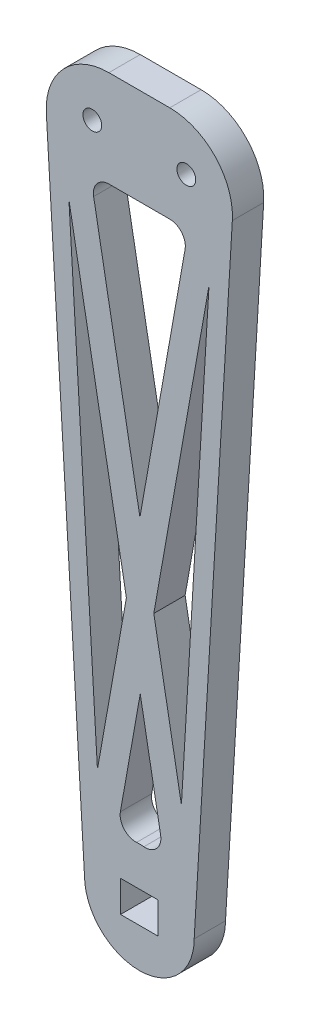
ISO-10303-21;
HEADER;
FILE_DESCRIPTION(('STEP AP214'),'2;1');
FILE_NAME('part.step','',(''),(''),'','','');
FILE_SCHEMA(('AUTOMOTIVE_DESIGN { 1 0 10303 214 1 1 1 1 }'));
ENDSEC;
DATA;
#1=APPLICATION_CONTEXT('core data for automotive mechanical design processes');
#2=APPLICATION_PROTOCOL_DEFINITION('international standard','automotive_design',2000,#1);
#3=PRODUCT_CONTEXT('',#1,'mechanical');
#4=PRODUCT('Part','Part','',(#3));
#5=PRODUCT_RELATED_PRODUCT_CATEGORY('part','',(#4));
#6=PRODUCT_DEFINITION_FORMATION('','',#4);
#7=PRODUCT_DEFINITION_CONTEXT('part definition',#1,'design');
#8=PRODUCT_DEFINITION('design','',#6,#7);
#9=PRODUCT_DEFINITION_SHAPE('','',#8);
#10=(LENGTH_UNIT() NAMED_UNIT(*) SI_UNIT(.MILLI.,.METRE.));
#11=(NAMED_UNIT(*) PLANE_ANGLE_UNIT() SI_UNIT($,.RADIAN.));
#12=(NAMED_UNIT(*) SI_UNIT($,.STERADIAN.) SOLID_ANGLE_UNIT());
#13=UNCERTAINTY_MEASURE_WITH_UNIT(LENGTH_MEASURE(1.E-05),#10,'distance_accuracy_value','');
#14=(GEOMETRIC_REPRESENTATION_CONTEXT(3) GLOBAL_UNCERTAINTY_ASSIGNED_CONTEXT((#13)) GLOBAL_UNIT_ASSIGNED_CONTEXT((#10,
#11,#12)) REPRESENTATION_CONTEXT('',''));
#15=CARTESIAN_POINT('',(0.,0.,0.));
#16=DIRECTION('',(0.,0.,1.));
#17=DIRECTION('',(1.,0.,0.));
#18=AXIS2_PLACEMENT_3D('',#15,#16,#17);
#19=CARTESIAN_POINT('',(0.,0.,10.));
#20=DIRECTION('',(0.,0.,1.));
#21=DIRECTION('',(1.,0.,0.));
#22=AXIS2_PLACEMENT_3D('',#19,#20,#21);
#23=PLANE('',#22);
#24=DIRECTION('',(-0.0594186399842153,-0.998233151734817,0.));
#25=VECTOR('',#24,1.);
#26=CARTESIAN_POINT('',(29.8940827566728,-1.77940968789719,10.));
#27=LINE('',#26,#25);
#28=CARTESIAN_POINT('',(29.6775023841983,-5.41795994546837,10.));
#29=VERTEX_POINT('',#28);
#30=CARTESIAN_POINT('',(17.5,-210.,10.));
#31=VERTEX_POINT('',#30);
#32=EDGE_CURVE('E382',#29,#31,#27,.T.);
#33=ORIENTED_EDGE('',*,*,#32,.F.);
#34=CARTESIAN_POINT('',(9.71283934950197,-4.22958714578407,10.));
#35=DIRECTION('',(0.,0.,1.));
#36=DIRECTION('',(1.,0.,0.));
#37=AXIS2_PLACEMENT_3D('',#34,#35,#36);
#38=CIRCLE('',#37,20.);
#39=CARTESIAN_POINT('',(9.71283934950197,15.7704128542159,10.));
#40=VERTEX_POINT('',#39);
#41=EDGE_CURVE('E461',#29,#40,#38,.T.);
#42=ORIENTED_EDGE('',*,*,#41,.T.);
#43=DIRECTION('',(1.,0.,0.));
#44=VECTOR('',#43,1.);
#45=CARTESIAN_POINT('',(0.,15.7704128542159,10.));
#46=LINE('',#45,#44);
#47=CARTESIAN_POINT('',(-9.71283934950197,15.7704128542159,10.));
#48=VERTEX_POINT('',#47);
#49=EDGE_CURVE('E384',#48,#40,#46,.T.);
#50=ORIENTED_EDGE('',*,*,#49,.F.);
#51=CARTESIAN_POINT('',(-9.71283934950197,-4.22958714578407,10.));
#52=DIRECTION('',(0.,0.,1.));
#53=DIRECTION('',(1.,0.,0.));
#54=AXIS2_PLACEMENT_3D('',#51,#52,#53);
#55=CIRCLE('',#54,20.);
#56=CARTESIAN_POINT('',(-29.6775023841983,-5.41795994546837,10.));
#57=VERTEX_POINT('',#56);
#58=EDGE_CURVE('E452',#48,#57,#55,.T.);
#59=ORIENTED_EDGE('',*,*,#58,.T.);
#60=DIRECTION('',(0.0594186399842153,-0.998233151734817,0.));
#61=VECTOR('',#60,1.);
#62=CARTESIAN_POINT('',(-29.8940827566728,-1.77940968789719,10.));
#63=LINE('',#62,#61);
#64=CARTESIAN_POINT('',(-17.5,-210.,10.));
#65=VERTEX_POINT('',#64);
#66=EDGE_CURVE('E376',#57,#65,#63,.T.);
#67=ORIENTED_EDGE('',*,*,#66,.T.);
#68=CARTESIAN_POINT('',(0.,-210.,10.));
#69=DIRECTION('',(0.,0.,1.));
#70=DIRECTION('',(1.,0.,0.));
#71=AXIS2_PLACEMENT_3D('',#68,#69,#70);
#72=CIRCLE('',#71,17.5);
#73=EDGE_CURVE('E378',#65,#31,#72,.T.);
#74=ORIENTED_EDGE('',*,*,#73,.T.);
#75=EDGE_LOOP('',(#33,#42,#50,#59,#67,#74));
#76=FACE_BOUND('',#75,.T.);
#77=CARTESIAN_POINT('',(15.,0.,10.));
#78=DIRECTION('',(0.,0.,1.));
#79=DIRECTION('',(1.,0.,0.));
#80=AXIS2_PLACEMENT_3D('',#77,#78,#79);
#81=CIRCLE('',#80,3.);
#82=CARTESIAN_POINT('',(18.,0.,10.));
#83=VERTEX_POINT('',#82);
#84=EDGE_CURVE('E387',#83,#83,#81,.T.);
#85=ORIENTED_EDGE('',*,*,#84,.F.);
#86=EDGE_LOOP('',(#85));
#87=FACE_BOUND('',#86,.T.);
#88=CARTESIAN_POINT('',(-15.,0.,10.));
#89=DIRECTION('',(0.,0.,1.));
#90=DIRECTION('',(1.,0.,0.));
#91=AXIS2_PLACEMENT_3D('',#88,#89,#90);
#92=CIRCLE('',#91,3.);
#93=CARTESIAN_POINT('',(-12.,0.,10.));
#94=VERTEX_POINT('',#93);
#95=EDGE_CURVE('E390',#94,#94,#92,.T.);
#96=ORIENTED_EDGE('',*,*,#95,.F.);
#97=EDGE_LOOP('',(#96));
#98=FACE_BOUND('',#97,.T.);
#99=DIRECTION('',(0.,1.,0.));
#100=VECTOR('',#99,1.);
#101=CARTESIAN_POINT('',(-6.00000000000001,0.,10.));
#102=LINE('',#101,#100);
#103=CARTESIAN_POINT('',(-6.00000000000001,-215.,10.));
#104=VERTEX_POINT('',#103);
#105=CARTESIAN_POINT('',(-6.00000000000001,-205.,10.));
#106=VERTEX_POINT('',#105);
#107=EDGE_CURVE('E393',#104,#106,#102,.T.);
#108=ORIENTED_EDGE('',*,*,#107,.T.);
#109=DIRECTION('',(1.,0.,0.));
#110=VECTOR('',#109,1.);
#111=CARTESIAN_POINT('',(4.74157750100327E-13,-205.,10.));
#112=LINE('',#111,#110);
#113=CARTESIAN_POINT('',(6.,-205.,10.));
#114=VERTEX_POINT('',#113);
#115=EDGE_CURVE('E396',#106,#114,#112,.T.);
#116=ORIENTED_EDGE('',*,*,#115,.T.);
#117=DIRECTION('',(0.,1.,0.));
#118=VECTOR('',#117,1.);
#119=CARTESIAN_POINT('',(5.99999999999989,0.,10.));
#120=LINE('',#119,#118);
#121=CARTESIAN_POINT('',(6.00000000000001,-215.,10.));
#122=VERTEX_POINT('',#121);
#123=EDGE_CURVE('E398',#122,#114,#120,.T.);
#124=ORIENTED_EDGE('',*,*,#123,.F.);
#125=DIRECTION('',(1.,0.,0.));
#126=VECTOR('',#125,1.);
#127=CARTESIAN_POINT('',(-4.97287396446684E-13,-215.,10.));
#128=LINE('',#127,#126);
#129=EDGE_CURVE('E401',#104,#122,#128,.T.);
#130=ORIENTED_EDGE('',*,*,#129,.F.);
#131=EDGE_LOOP('',(#108,#116,#124,#130));
#132=FACE_BOUND('',#131,.T.);
#133=DIRECTION('',(0.174574666070561,0.984643938673444,0.));
#134=VECTOR('',#133,1.);
#135=CARTESIAN_POINT('',(17.7452712206691,-3.14618785126878,10.));
#136=LINE('',#135,#134);
#137=CARTESIAN_POINT('',(0.190220551076297,-102.160979768059,10.));
#138=VERTEX_POINT('',#137);
#139=CARTESIAN_POINT('',(14.6023785703389,-20.8728733303528,10.));
#140=VERTEX_POINT('',#139);
#141=EDGE_CURVE('E370',#138,#140,#136,.T.);
#142=ORIENTED_EDGE('',*,*,#141,.F.);
#143=DIRECTION('',(-0.178826073356073,0.983880701857724,0.));
#144=VECTOR('',#143,1.);
#145=CARTESIAN_POINT('',(-17.7904251161172,-3.23351384049256,10.));
#146=LINE('',#145,#144);
#147=CARTESIAN_POINT('',(-14.5805047462184,-20.8941303667804,10.));
#148=VERTEX_POINT('',#147);
#149=EDGE_CURVE('E334',#138,#148,#146,.T.);
#150=ORIENTED_EDGE('',*,*,#149,.T.);
#151=CARTESIAN_POINT('',(-9.66110123692979,-20.,10.));
#152=DIRECTION('',(0.,0.,1.));
#153=DIRECTION('',(1.,0.,0.));
#154=AXIS2_PLACEMENT_3D('',#151,#152,#153);
#155=CIRCLE('',#154,5.);
#156=CARTESIAN_POINT('',(-9.66110123692979,-15.,10.));
#157=VERTEX_POINT('',#156);
#158=EDGE_CURVE('E487',#148,#157,#155,.F.);
#159=ORIENTED_EDGE('',*,*,#158,.T.);
#160=DIRECTION('',(1.,0.,0.));
#161=VECTOR('',#160,1.);
#162=CARTESIAN_POINT('',(0.,-15.,10.));
#163=LINE('',#162,#161);
#164=CARTESIAN_POINT('',(9.67915887697167,-15.,10.));
#165=VERTEX_POINT('',#164);
#166=EDGE_CURVE('E362',#157,#165,#163,.T.);
#167=ORIENTED_EDGE('',*,*,#166,.T.);
#168=CARTESIAN_POINT('',(9.67915887697167,-20.,10.));
#169=DIRECTION('',(0.,0.,1.));
#170=DIRECTION('',(1.,0.,0.));
#171=AXIS2_PLACEMENT_3D('',#168,#169,#170);
#172=CIRCLE('',#171,5.);
#173=EDGE_CURVE('E115',#165,#140,#172,.F.);
#174=ORIENTED_EDGE('',*,*,#173,.T.);
#175=EDGE_LOOP('',(#142,#150,#159,#167,#174));
#176=FACE_BOUND('',#175,.T.);
#177=DIRECTION('',(-0.178826073356073,0.983880701857724,0.));
#178=VECTOR('',#177,1.);
#179=CARTESIAN_POINT('',(-26.2678721622271,-4.77433943497515,10.));
#180=LINE('',#179,#178);
#181=CARTESIAN_POINT('',(6.79531038371948,-186.684206595022,10.));
#182=VERTEX_POINT('',#181);
#183=CARTESIAN_POINT('',(0.29160959832128,-150.901585116392,10.));
#184=VERTEX_POINT('',#183);
#185=EDGE_CURVE('E283',#182,#184,#180,.T.);
#186=ORIENTED_EDGE('',*,*,#185,.F.);
#187=CARTESIAN_POINT('',(1.87590687443086,-187.578336961803,10.));
#188=DIRECTION('',(0.,0.,1.));
#189=DIRECTION('',(1.,0.,0.));
#190=AXIS2_PLACEMENT_3D('',#187,#188,#189);
#191=CIRCLE('',#190,5.);
#192=CARTESIAN_POINT('',(1.45903868011289,-192.560928748069,10.));
#193=VERTEX_POINT('',#192);
#194=EDGE_CURVE('E480',#182,#193,#191,.F.);
#195=ORIENTED_EDGE('',*,*,#194,.T.);
#196=CARTESIAN_POINT('',(0.,-210.,10.));
#197=DIRECTION('',(0.,0.,1.));
#198=DIRECTION('',(1.,0.,0.));
#199=AXIS2_PLACEMENT_3D('',#196,#197,#198);
#200=CIRCLE('',#199,17.5);
#201=CARTESIAN_POINT('',(-0.874372767581587,-192.521857299378,10.));
#202=VERTEX_POINT('',#201);
#203=EDGE_CURVE('E299',#193,#202,#200,.T.);
#204=ORIENTED_EDGE('',*,*,#203,.T.);
#205=CARTESIAN_POINT('',(-1.12419355831918,-187.528102242057,10.));
#206=DIRECTION('',(0.,0.,1.));
#207=DIRECTION('',(1.,0.,0.));
#208=AXIS2_PLACEMENT_3D('',#205,#206,#207);
#209=CIRCLE('',#208,5.);
#210=CARTESIAN_POINT('',(-6.0474132516864,-186.655228911704,10.));
#211=VERTEX_POINT('',#210);
#212=EDGE_CURVE('E285',#202,#211,#209,.F.);
#213=ORIENTED_EDGE('',*,*,#212,.T.);
#214=DIRECTION('',(0.174574666070561,0.984643938673444,0.));
#215=VECTOR('',#214,1.);
#216=CARTESIAN_POINT('',(26.2217824014059,-4.64905000346376,10.));
#217=LINE('',#216,#215);
#218=EDGE_CURVE('E280',#211,#184,#217,.T.);
#219=ORIENTED_EDGE('',*,*,#218,.T.);
#220=EDGE_LOOP('',(#186,#195,#204,#213,#219));
#221=FACE_BOUND('',#220,.T.);
#222=DIRECTION('',(-0.178826073356073,0.983880701857724,0.));
#223=VECTOR('',#222,1.);
#224=CARTESIAN_POINT('',(-17.7904251161172,-3.23351384049256,10.));
#225=LINE('',#224,#223);
#226=CARTESIAN_POINT('',(13.4301626709257,-175.005634358752,10.));
#227=VERTEX_POINT('',#226);
#228=CARTESIAN_POINT('',(4.61598635326493,-126.511039476885,10.));
#229=VERTEX_POINT('',#228);
#230=EDGE_CURVE('E308',#227,#229,#225,.T.);
#231=ORIENTED_EDGE('',*,*,#230,.T.);
#232=DIRECTION('',(0.174574666070561,0.984643938673444,0.));
#233=VECTOR('',#232,1.);
#234=CARTESIAN_POINT('',(26.2217824014059,-4.64905000346376,10.));
#235=LINE('',#234,#233);
#236=CARTESIAN_POINT('',(22.2304198411749,-27.1613138985647,10.));
#237=VERTEX_POINT('',#236);
#238=EDGE_CURVE('E305',#229,#237,#235,.T.);
#239=ORIENTED_EDGE('',*,*,#238,.T.);
#240=DIRECTION('',(-0.0594186399842153,-0.998233151734817,0.));
#241=VECTOR('',#240,1.);
#242=CARTESIAN_POINT('',(23.7629705178262,-1.41446253082299,10.));
#243=LINE('',#242,#241);
#244=EDGE_CURVE('E342',#237,#227,#243,.T.);
#245=ORIENTED_EDGE('',*,*,#244,.T.);
#246=EDGE_LOOP('',(#231,#239,#245));
#247=FACE_BOUND('',#246,.T.);
#248=DIRECTION('',(0.174574666070561,0.984643938673444,0.));
#249=VECTOR('',#248,1.);
#250=CARTESIAN_POINT('',(17.7452712206691,-3.14618785126878,10.));
#251=LINE('',#250,#249);
#252=CARTESIAN_POINT('',(-13.367328464566,-178.628881795291,10.));
#253=VERTEX_POINT('',#252);
#254=CARTESIAN_POINT('',(-4.13415620386734,-126.551525407566,10.));
#255=VERTEX_POINT('',#254);
#256=EDGE_CURVE('E326',#253,#255,#251,.T.);
#257=ORIENTED_EDGE('',*,*,#256,.F.);
#258=DIRECTION('',(-0.0594186399842153,0.998233151734817,0.));
#259=VECTOR('',#258,1.);
#260=CARTESIAN_POINT('',(-23.9152662053382,-1.42352775031775,10.));
#261=LINE('',#260,#259);
#262=CARTESIAN_POINT('',(-22.4730270714025,-25.6531452004381,10.));
#263=VERTEX_POINT('',#262);
#264=EDGE_CURVE('E323',#253,#263,#261,.T.);
#265=ORIENTED_EDGE('',*,*,#264,.T.);
#266=DIRECTION('',(-0.178826073356073,0.983880701857724,0.));
#267=VECTOR('',#266,1.);
#268=CARTESIAN_POINT('',(-26.2678721622271,-4.77433943497515,10.));
#269=LINE('',#268,#267);
#270=EDGE_CURVE('E316',#255,#263,#269,.T.);
#271=ORIENTED_EDGE('',*,*,#270,.F.);
#272=EDGE_LOOP('',(#257,#265,#271));
#273=FACE_BOUND('',#272,.T.);
#274=ADVANCED_FACE('F107',(#76,#87,#98,#132,#176,#221,#247,#273),#23,.T.);
#275=CARTESIAN_POINT('',(0.,0.,0.));
#276=DIRECTION('',(0.,0.,1.));
#277=DIRECTION('',(1.,0.,0.));
#278=AXIS2_PLACEMENT_3D('',#275,#276,#277);
#279=PLANE('',#278);
#280=DIRECTION('',(0.174574666070561,0.984643938673444,0.));
#281=VECTOR('',#280,1.);
#282=CARTESIAN_POINT('',(26.2217824014059,-4.64905000346376,0.));
#283=LINE('',#282,#281);
#284=CARTESIAN_POINT('',(4.61598635326493,-126.511039476885,0.));
#285=VERTEX_POINT('',#284);
#286=CARTESIAN_POINT('',(22.2304198411749,-27.1613138985647,0.));
#287=VERTEX_POINT('',#286);
#288=EDGE_CURVE('E339',#285,#287,#283,.T.);
#289=ORIENTED_EDGE('',*,*,#288,.F.);
#290=DIRECTION('',(-0.178826073356073,0.983880701857724,0.));
#291=VECTOR('',#290,1.);
#292=CARTESIAN_POINT('',(-17.7904251161172,-3.23351384049256,0.));
#293=LINE('',#292,#291);
#294=CARTESIAN_POINT('',(13.4301626709257,-175.005634358752,0.));
#295=VERTEX_POINT('',#294);
#296=EDGE_CURVE('E341',#295,#285,#293,.T.);
#297=ORIENTED_EDGE('',*,*,#296,.F.);
#298=DIRECTION('',(-0.0594186399842153,-0.998233151734817,0.));
#299=VECTOR('',#298,1.);
#300=CARTESIAN_POINT('',(23.7629705178262,-1.41446253082299,0.));
#301=LINE('',#300,#299);
#302=EDGE_CURVE('E344',#287,#295,#301,.T.);
#303=ORIENTED_EDGE('',*,*,#302,.F.);
#304=EDGE_LOOP('',(#289,#297,#303));
#305=FACE_BOUND('',#304,.T.);
#306=DIRECTION('',(-0.178826073356073,0.983880701857724,0.));
#307=VECTOR('',#306,1.);
#308=CARTESIAN_POINT('',(-17.7904251161172,-3.23351384049256,0.));
#309=LINE('',#308,#307);
#310=CARTESIAN_POINT('',(0.190220551076304,-102.160979768059,0.));
#311=VERTEX_POINT('',#310);
#312=CARTESIAN_POINT('',(-14.5805047462184,-20.8941303667804,0.));
#313=VERTEX_POINT('',#312);
#314=EDGE_CURVE('E358',#311,#313,#309,.T.);
#315=ORIENTED_EDGE('',*,*,#314,.F.);
#316=DIRECTION('',(0.174574666070561,0.984643938673444,0.));
#317=VECTOR('',#316,1.);
#318=CARTESIAN_POINT('',(17.7452712206691,-3.14618785126878,0.));
#319=LINE('',#318,#317);
#320=CARTESIAN_POINT('',(14.6023785703389,-20.8728733303528,0.));
#321=VERTEX_POINT('',#320);
#322=EDGE_CURVE('E361',#311,#321,#319,.T.);
#323=ORIENTED_EDGE('',*,*,#322,.T.);
#324=CARTESIAN_POINT('',(9.67915887697167,-20.,0.));
#325=DIRECTION('',(0.,0.,1.));
#326=DIRECTION('',(1.,0.,0.));
#327=AXIS2_PLACEMENT_3D('',#324,#325,#326);
#328=CIRCLE('',#327,5.);
#329=CARTESIAN_POINT('',(9.67915887697167,-15.,0.));
#330=VERTEX_POINT('',#329);
#331=EDGE_CURVE('E12',#321,#330,#328,.T.);
#332=ORIENTED_EDGE('',*,*,#331,.T.);
#333=DIRECTION('',(1.,0.,0.));
#334=VECTOR('',#333,1.);
#335=CARTESIAN_POINT('',(0.,-15.,0.));
#336=LINE('',#335,#334);
#337=CARTESIAN_POINT('',(-9.66110123692979,-15.,0.));
#338=VERTEX_POINT('',#337);
#339=EDGE_CURVE('E364',#338,#330,#336,.T.);
#340=ORIENTED_EDGE('',*,*,#339,.F.);
#341=CARTESIAN_POINT('',(-9.66110123692979,-20.,0.));
#342=DIRECTION('',(0.,0.,1.));
#343=DIRECTION('',(1.,0.,0.));
#344=AXIS2_PLACEMENT_3D('',#341,#342,#343);
#345=CIRCLE('',#344,5.);
#346=EDGE_CURVE('E489',#338,#313,#345,.T.);
#347=ORIENTED_EDGE('',*,*,#346,.T.);
#348=EDGE_LOOP('',(#315,#323,#332,#340,#347));
#349=FACE_BOUND('',#348,.T.);
#350=DIRECTION('',(1.,0.,0.));
#351=VECTOR('',#350,1.);
#352=CARTESIAN_POINT('',(0.,15.7704128542159,0.));
#353=LINE('',#352,#351);
#354=CARTESIAN_POINT('',(-9.71283934950197,15.7704128542159,0.));
#355=VERTEX_POINT('',#354);
#356=CARTESIAN_POINT('',(9.71283934950197,15.7704128542159,0.));
#357=VERTEX_POINT('',#356);
#358=EDGE_CURVE('E411',#355,#357,#353,.T.);
#359=ORIENTED_EDGE('',*,*,#358,.T.);
#360=CARTESIAN_POINT('',(9.71283934950197,-4.22958714578407,0.));
#361=DIRECTION('',(0.,0.,1.));
#362=DIRECTION('',(1.,0.,0.));
#363=AXIS2_PLACEMENT_3D('',#360,#361,#362);
#364=CIRCLE('',#363,20.);
#365=CARTESIAN_POINT('',(29.6775023841983,-5.41795994546837,0.));
#366=VERTEX_POINT('',#365);
#367=EDGE_CURVE('E457',#357,#366,#364,.F.);
#368=ORIENTED_EDGE('',*,*,#367,.T.);
#369=DIRECTION('',(-0.0594186399842153,-0.998233151734817,0.));
#370=VECTOR('',#369,1.);
#371=CARTESIAN_POINT('',(29.8940827566728,-1.77940968789719,0.));
#372=LINE('',#371,#370);
#373=CARTESIAN_POINT('',(17.5,-210.,0.));
#374=VERTEX_POINT('',#373);
#375=EDGE_CURVE('E409',#366,#374,#372,.T.);
#376=ORIENTED_EDGE('',*,*,#375,.T.);
#377=CARTESIAN_POINT('',(0.,-210.,0.));
#378=DIRECTION('',(0.,0.,1.));
#379=DIRECTION('',(1.,0.,0.));
#380=AXIS2_PLACEMENT_3D('',#377,#378,#379);
#381=CIRCLE('',#380,17.5);
#382=CARTESIAN_POINT('',(-17.5,-210.,0.));
#383=VERTEX_POINT('',#382);
#384=EDGE_CURVE('E406',#383,#374,#381,.T.);
#385=ORIENTED_EDGE('',*,*,#384,.F.);
#386=DIRECTION('',(0.0594186399842153,-0.998233151734817,0.));
#387=VECTOR('',#386,1.);
#388=CARTESIAN_POINT('',(-29.8940827566728,-1.77940968789719,0.));
#389=LINE('',#388,#387);
#390=CARTESIAN_POINT('',(-29.6775023841983,-5.41795994546837,0.));
#391=VERTEX_POINT('',#390);
#392=EDGE_CURVE('E375',#391,#383,#389,.T.);
#393=ORIENTED_EDGE('',*,*,#392,.F.);
#394=CARTESIAN_POINT('',(-9.71283934950197,-4.22958714578407,0.));
#395=DIRECTION('',(0.,0.,1.));
#396=DIRECTION('',(1.,0.,0.));
#397=AXIS2_PLACEMENT_3D('',#394,#395,#396);
#398=CIRCLE('',#397,20.);
#399=EDGE_CURVE('E448',#391,#355,#398,.F.);
#400=ORIENTED_EDGE('',*,*,#399,.T.);
#401=EDGE_LOOP('',(#359,#368,#376,#385,#393,#400));
#402=FACE_BOUND('',#401,.T.);
#403=CARTESIAN_POINT('',(15.,0.,0.));
#404=DIRECTION('',(0.,0.,1.));
#405=DIRECTION('',(1.,0.,0.));
#406=AXIS2_PLACEMENT_3D('',#403,#404,#405);
#407=CIRCLE('',#406,3.);
#408=CARTESIAN_POINT('',(18.,0.,0.));
#409=VERTEX_POINT('',#408);
#410=EDGE_CURVE('E414',#409,#409,#407,.T.);
#411=ORIENTED_EDGE('',*,*,#410,.T.);
#412=EDGE_LOOP('',(#411));
#413=FACE_BOUND('',#412,.T.);
#414=CARTESIAN_POINT('',(-15.,0.,0.));
#415=DIRECTION('',(0.,0.,1.));
#416=DIRECTION('',(1.,0.,0.));
#417=AXIS2_PLACEMENT_3D('',#414,#415,#416);
#418=CIRCLE('',#417,3.);
#419=CARTESIAN_POINT('',(-12.,0.,0.));
#420=VERTEX_POINT('',#419);
#421=EDGE_CURVE('E417',#420,#420,#418,.T.);
#422=ORIENTED_EDGE('',*,*,#421,.T.);
#423=EDGE_LOOP('',(#422));
#424=FACE_BOUND('',#423,.T.);
#425=DIRECTION('',(0.,1.,0.));
#426=VECTOR('',#425,1.);
#427=CARTESIAN_POINT('',(-6.00000000000001,0.,0.));
#428=LINE('',#427,#426);
#429=CARTESIAN_POINT('',(-6.00000000000001,-215.,0.));
#430=VERTEX_POINT('',#429);
#431=CARTESIAN_POINT('',(-6.00000000000001,-205.,0.));
#432=VERTEX_POINT('',#431);
#433=EDGE_CURVE('E420',#430,#432,#428,.T.);
#434=ORIENTED_EDGE('',*,*,#433,.F.);
#435=DIRECTION('',(1.,0.,0.));
#436=VECTOR('',#435,1.);
#437=CARTESIAN_POINT('',(-4.97287396446684E-13,-215.,0.));
#438=LINE('',#437,#436);
#439=CARTESIAN_POINT('',(6.00000000000001,-215.,0.));
#440=VERTEX_POINT('',#439);
#441=EDGE_CURVE('E379',#430,#440,#438,.T.);
#442=ORIENTED_EDGE('',*,*,#441,.T.);
#443=DIRECTION('',(0.,1.,0.));
#444=VECTOR('',#443,1.);
#445=CARTESIAN_POINT('',(5.99999999999989,0.,0.));
#446=LINE('',#445,#444);
#447=CARTESIAN_POINT('',(6.,-205.,0.));
#448=VERTEX_POINT('',#447);
#449=EDGE_CURVE('E426',#440,#448,#446,.T.);
#450=ORIENTED_EDGE('',*,*,#449,.T.);
#451=DIRECTION('',(1.,0.,0.));
#452=VECTOR('',#451,1.);
#453=CARTESIAN_POINT('',(4.74157750100327E-13,-205.,0.));
#454=LINE('',#453,#452);
#455=EDGE_CURVE('E423',#432,#448,#454,.T.);
#456=ORIENTED_EDGE('',*,*,#455,.F.);
#457=EDGE_LOOP('',(#434,#442,#450,#456));
#458=FACE_BOUND('',#457,.T.);
#459=CARTESIAN_POINT('',(0.,-210.,0.));
#460=DIRECTION('',(0.,0.,1.));
#461=DIRECTION('',(1.,0.,0.));
#462=AXIS2_PLACEMENT_3D('',#459,#460,#461);
#463=CIRCLE('',#462,17.5);
#464=CARTESIAN_POINT('',(1.45903868011289,-192.560928748069,0.));
#465=VERTEX_POINT('',#464);
#466=CARTESIAN_POINT('',(-0.874372767581587,-192.521857299378,0.));
#467=VERTEX_POINT('',#466);
#468=EDGE_CURVE('E289',#465,#467,#463,.T.);
#469=ORIENTED_EDGE('',*,*,#468,.F.);
#470=CARTESIAN_POINT('',(1.87590687443086,-187.578336961803,0.));
#471=DIRECTION('',(0.,0.,1.));
#472=DIRECTION('',(1.,0.,0.));
#473=AXIS2_PLACEMENT_3D('',#470,#471,#472);
#474=CIRCLE('',#473,5.);
#475=CARTESIAN_POINT('',(6.79531038371948,-186.684206595022,0.));
#476=VERTEX_POINT('',#475);
#477=EDGE_CURVE('E482',#465,#476,#474,.T.);
#478=ORIENTED_EDGE('',*,*,#477,.T.);
#479=DIRECTION('',(-0.178826073356073,0.983880701857724,0.));
#480=VECTOR('',#479,1.);
#481=CARTESIAN_POINT('',(-26.2678721622271,-4.77433943497515,0.));
#482=LINE('',#481,#480);
#483=CARTESIAN_POINT('',(0.291609598321283,-150.901585116392,0.));
#484=VERTEX_POINT('',#483);
#485=EDGE_CURVE('E310',#476,#484,#482,.T.);
#486=ORIENTED_EDGE('',*,*,#485,.T.);
#487=DIRECTION('',(0.174574666070561,0.984643938673444,0.));
#488=VECTOR('',#487,1.);
#489=CARTESIAN_POINT('',(26.2217824014059,-4.64905000346376,0.));
#490=LINE('',#489,#488);
#491=CARTESIAN_POINT('',(-6.0474132516864,-186.655228911704,0.));
#492=VERTEX_POINT('',#491);
#493=EDGE_CURVE('E303',#492,#484,#490,.T.);
#494=ORIENTED_EDGE('',*,*,#493,.F.);
#495=CARTESIAN_POINT('',(-1.12419355831918,-187.528102242057,0.));
#496=DIRECTION('',(0.,0.,1.));
#497=DIRECTION('',(1.,0.,0.));
#498=AXIS2_PLACEMENT_3D('',#495,#496,#497);
#499=CIRCLE('',#498,5.);
#500=EDGE_CURVE('E485',#492,#467,#499,.T.);
#501=ORIENTED_EDGE('',*,*,#500,.T.);
#502=EDGE_LOOP('',(#469,#478,#486,#494,#501));
#503=FACE_BOUND('',#502,.T.);
#504=DIRECTION('',(-0.0594186399842153,0.998233151734817,0.));
#505=VECTOR('',#504,1.);
#506=CARTESIAN_POINT('',(-23.9152662053382,-1.42352775031775,0.));
#507=LINE('',#506,#505);
#508=CARTESIAN_POINT('',(-13.367328464566,-178.628881795291,0.));
#509=VERTEX_POINT('',#508);
#510=CARTESIAN_POINT('',(-22.4730270714025,-25.6531452004381,0.));
#511=VERTEX_POINT('',#510);
#512=EDGE_CURVE('E313',#509,#511,#507,.T.);
#513=ORIENTED_EDGE('',*,*,#512,.F.);
#514=DIRECTION('',(0.174574666070561,0.984643938673444,0.));
#515=VECTOR('',#514,1.);
#516=CARTESIAN_POINT('',(17.7452712206691,-3.14618785126878,0.));
#517=LINE('',#516,#515);
#518=CARTESIAN_POINT('',(-4.13415620386734,-126.551525407566,0.));
#519=VERTEX_POINT('',#518);
#520=EDGE_CURVE('E315',#509,#519,#517,.T.);
#521=ORIENTED_EDGE('',*,*,#520,.T.);
#522=DIRECTION('',(-0.178826073356073,0.983880701857724,0.));
#523=VECTOR('',#522,1.);
#524=CARTESIAN_POINT('',(-26.2678721622271,-4.77433943497515,0.));
#525=LINE('',#524,#523);
#526=EDGE_CURVE('E319',#519,#511,#525,.T.);
#527=ORIENTED_EDGE('',*,*,#526,.T.);
#528=EDGE_LOOP('',(#513,#521,#527));
#529=FACE_BOUND('',#528,.T.);
#530=ADVANCED_FACE('F494',(#305,#349,#402,#413,#424,#458,#503,#529),#279,.F.);
#531=CARTESIAN_POINT('',(-6.00000000000001,0.,10.));
#532=DIRECTION('',(-1.,0.,0.));
#533=DIRECTION('',(0.,0.,1.));
#534=AXIS2_PLACEMENT_3D('',#531,#532,#533);
#535=PLANE('',#534);
#536=ORIENTED_EDGE('',*,*,#433,.T.);
#537=DIRECTION('',(0.,0.,-1.));
#538=VECTOR('',#537,1.);
#539=CARTESIAN_POINT('',(-6.00000000000001,-205.,10.));
#540=LINE('',#539,#538);
#541=EDGE_CURVE('E438',#106,#432,#540,.T.);
#542=ORIENTED_EDGE('',*,*,#541,.F.);
#543=ORIENTED_EDGE('',*,*,#107,.F.);
#544=DIRECTION('',(0.,0.,-1.));
#545=VECTOR('',#544,1.);
#546=CARTESIAN_POINT('',(-6.00000000000001,-215.,10.));
#547=LINE('',#546,#545);
#548=EDGE_CURVE('E431',#104,#430,#547,.T.);
#549=ORIENTED_EDGE('',*,*,#548,.T.);
#550=EDGE_LOOP('',(#536,#542,#543,#549));
#551=FACE_BOUND('',#550,.T.);
#552=ADVANCED_FACE('F527',(#551),#535,.F.);
#553=CARTESIAN_POINT('',(4.74157750100327E-13,-205.,10.));
#554=DIRECTION('',(0.,1.,0.));
#555=DIRECTION('',(-1.,0.,0.));
#556=AXIS2_PLACEMENT_3D('',#553,#554,#555);
#557=PLANE('',#556);
#558=ORIENTED_EDGE('',*,*,#455,.T.);
#559=DIRECTION('',(0.,0.,-1.));
#560=VECTOR('',#559,1.);
#561=CARTESIAN_POINT('',(6.,-205.,10.));
#562=LINE('',#561,#560);
#563=EDGE_CURVE('E436',#114,#448,#562,.T.);
#564=ORIENTED_EDGE('',*,*,#563,.F.);
#565=ORIENTED_EDGE('',*,*,#115,.F.);
#566=ORIENTED_EDGE('',*,*,#541,.T.);
#567=EDGE_LOOP('',(#558,#564,#565,#566));
#568=FACE_BOUND('',#567,.T.);
#569=ADVANCED_FACE('F543',(#568),#557,.F.);
#570=CARTESIAN_POINT('',(5.99999999999989,0.,10.));
#571=DIRECTION('',(-1.,0.,0.));
#572=DIRECTION('',(0.,-1.,0.));
#573=AXIS2_PLACEMENT_3D('',#570,#571,#572);
#574=PLANE('',#573);
#575=ORIENTED_EDGE('',*,*,#449,.F.);
#576=DIRECTION('',(0.,0.,-1.));
#577=VECTOR('',#576,1.);
#578=CARTESIAN_POINT('',(6.00000000000001,-215.,10.));
#579=LINE('',#578,#577);
#580=EDGE_CURVE('E433',#122,#440,#579,.T.);
#581=ORIENTED_EDGE('',*,*,#580,.F.);
#582=ORIENTED_EDGE('',*,*,#123,.T.);
#583=ORIENTED_EDGE('',*,*,#563,.T.);
#584=EDGE_LOOP('',(#575,#581,#582,#583));
#585=FACE_BOUND('',#584,.T.);
#586=ADVANCED_FACE('F539',(#585),#574,.T.);
#587=CARTESIAN_POINT('',(-29.8940827566728,-1.77940968789719,10.));
#588=DIRECTION('',(0.998233151734817,0.0594186399842152,0.));
#589=DIRECTION('',(-0.0594186399842152,0.998233151734817,0.));
#590=AXIS2_PLACEMENT_3D('',#587,#588,#589);
#591=PLANE('',#590);
#592=ORIENTED_EDGE('',*,*,#66,.F.);
#593=DIRECTION('',(0.,0.,-1.));
#594=VECTOR('',#593,1.);
#595=CARTESIAN_POINT('',(-29.6775023841983,-5.41795994546837,0.));
#596=LINE('',#595,#594);
#597=EDGE_CURVE('E441',#57,#391,#596,.T.);
#598=ORIENTED_EDGE('',*,*,#597,.T.);
#599=ORIENTED_EDGE('',*,*,#392,.T.);
#600=DIRECTION('',(0.,0.,-1.));
#601=VECTOR('',#600,1.);
#602=CARTESIAN_POINT('',(-17.5,-210.,10.));
#603=LINE('',#602,#601);
#604=EDGE_CURVE('E434',#65,#383,#603,.T.);
#605=ORIENTED_EDGE('',*,*,#604,.F.);
#606=EDGE_LOOP('',(#592,#598,#599,#605));
#607=FACE_BOUND('',#606,.T.);
#608=ADVANCED_FACE('F542',(#607),#591,.F.);
#609=CARTESIAN_POINT('',(0.,-210.,10.));
#610=DIRECTION('',(0.,0.,-1.));
#611=DIRECTION('',(-1.,0.,0.));
#612=AXIS2_PLACEMENT_3D('',#609,#610,#611);
#613=CYLINDRICAL_SURFACE('',#612,17.5);
#614=ORIENTED_EDGE('',*,*,#384,.T.);
#615=DIRECTION('',(0.,0.,-1.));
#616=VECTOR('',#615,1.);
#617=CARTESIAN_POINT('',(17.5,-210.,10.));
#618=LINE('',#617,#616);
#619=EDGE_CURVE('E404',#31,#374,#618,.T.);
#620=ORIENTED_EDGE('',*,*,#619,.F.);
#621=ORIENTED_EDGE('',*,*,#73,.F.);
#622=ORIENTED_EDGE('',*,*,#604,.T.);
#623=EDGE_LOOP('',(#614,#620,#621,#622));
#624=FACE_BOUND('',#623,.T.);
#625=ADVANCED_FACE('F565',(#624),#613,.T.);
#626=CARTESIAN_POINT('',(29.8940827566728,-1.77940968789719,10.));
#627=DIRECTION('',(0.998233151734817,-0.0594186399842152,0.));
#628=DIRECTION('',(0.0594186399842152,0.998233151734817,0.));
#629=AXIS2_PLACEMENT_3D('',#626,#627,#628);
#630=PLANE('',#629);
#631=ORIENTED_EDGE('',*,*,#375,.F.);
#632=DIRECTION('',(0.,0.,-1.));
#633=VECTOR('',#632,1.);
#634=CARTESIAN_POINT('',(29.6775023841983,-5.41795994546837,10.));
#635=LINE('',#634,#633);
#636=EDGE_CURVE('E459',#366,#29,#635,.F.);
#637=ORIENTED_EDGE('',*,*,#636,.T.);
#638=ORIENTED_EDGE('',*,*,#32,.T.);
#639=ORIENTED_EDGE('',*,*,#619,.T.);
#640=EDGE_LOOP('',(#631,#637,#638,#639));
#641=FACE_BOUND('',#640,.T.);
#642=ADVANCED_FACE('F561',(#641),#630,.T.);
#643=CARTESIAN_POINT('',(0.,15.7704128542159,10.));
#644=DIRECTION('',(0.,1.,0.));
#645=DIRECTION('',(0.,0.,1.));
#646=AXIS2_PLACEMENT_3D('',#643,#644,#645);
#647=PLANE('',#646);
#648=ORIENTED_EDGE('',*,*,#49,.T.);
#649=DIRECTION('',(0.,0.,-1.));
#650=VECTOR('',#649,1.);
#651=CARTESIAN_POINT('',(9.71283934950197,15.7704128542159,10.));
#652=LINE('',#651,#650);
#653=EDGE_CURVE('E454',#40,#357,#652,.T.);
#654=ORIENTED_EDGE('',*,*,#653,.T.);
#655=ORIENTED_EDGE('',*,*,#358,.F.);
#656=DIRECTION('',(0.,0.,-1.));
#657=VECTOR('',#656,1.);
#658=CARTESIAN_POINT('',(-9.71283934950197,15.7704128542159,10.));
#659=LINE('',#658,#657);
#660=EDGE_CURVE('E450',#355,#48,#659,.F.);
#661=ORIENTED_EDGE('',*,*,#660,.T.);
#662=EDGE_LOOP('',(#648,#654,#655,#661));
#663=FACE_BOUND('',#662,.T.);
#664=ADVANCED_FACE('F554',(#663),#647,.T.);
#665=CARTESIAN_POINT('',(-15.,0.,10.));
#666=DIRECTION('',(0.,0.,-1.));
#667=DIRECTION('',(-1.,0.,0.));
#668=AXIS2_PLACEMENT_3D('',#665,#666,#667);
#669=CYLINDRICAL_SURFACE('',#668,3.);
#670=ORIENTED_EDGE('',*,*,#95,.T.);
#671=EDGE_LOOP('',(#670));
#672=FACE_BOUND('',#671,.T.);
#673=ORIENTED_EDGE('',*,*,#421,.F.);
#674=EDGE_LOOP('',(#673));
#675=FACE_BOUND('',#674,.T.);
#676=ADVANCED_FACE('F551',(#672,#675),#669,.F.);
#677=CARTESIAN_POINT('',(15.,0.,10.));
#678=DIRECTION('',(0.,0.,-1.));
#679=DIRECTION('',(-1.,0.,0.));
#680=AXIS2_PLACEMENT_3D('',#677,#678,#679);
#681=CYLINDRICAL_SURFACE('',#680,3.);
#682=ORIENTED_EDGE('',*,*,#84,.T.);
#683=EDGE_LOOP('',(#682));
#684=FACE_BOUND('',#683,.T.);
#685=ORIENTED_EDGE('',*,*,#410,.F.);
#686=EDGE_LOOP('',(#685));
#687=FACE_BOUND('',#686,.T.);
#688=ADVANCED_FACE('F537',(#684,#687),#681,.F.);
#689=CARTESIAN_POINT('',(-4.97287396446684E-13,-215.,10.));
#690=DIRECTION('',(0.,1.,0.));
#691=DIRECTION('',(-1.,0.,0.));
#692=AXIS2_PLACEMENT_3D('',#689,#690,#691);
#693=PLANE('',#692);
#694=ORIENTED_EDGE('',*,*,#441,.F.);
#695=ORIENTED_EDGE('',*,*,#548,.F.);
#696=ORIENTED_EDGE('',*,*,#129,.T.);
#697=ORIENTED_EDGE('',*,*,#580,.T.);
#698=EDGE_LOOP('',(#694,#695,#696,#697));
#699=FACE_BOUND('',#698,.T.);
#700=ADVANCED_FACE('F533',(#699),#693,.T.);
#701=CARTESIAN_POINT('',(-9.71283934950197,-4.22958714578407,10.));
#702=DIRECTION('',(0.,0.,1.));
#703=DIRECTION('',(1.,0.,0.));
#704=AXIS2_PLACEMENT_3D('',#701,#702,#703);
#705=CYLINDRICAL_SURFACE('',#704,20.);
#706=ORIENTED_EDGE('',*,*,#58,.F.);
#707=ORIENTED_EDGE('',*,*,#660,.F.);
#708=ORIENTED_EDGE('',*,*,#399,.F.);
#709=ORIENTED_EDGE('',*,*,#597,.F.);
#710=EDGE_LOOP('',(#706,#707,#708,#709));
#711=FACE_BOUND('',#710,.T.);
#712=ADVANCED_FACE('F536',(#711),#705,.T.);
#713=CARTESIAN_POINT('',(9.71283934950197,-4.22958714578407,10.));
#714=DIRECTION('',(0.,0.,-1.));
#715=DIRECTION('',(-1.,0.,0.));
#716=AXIS2_PLACEMENT_3D('',#713,#714,#715);
#717=CYLINDRICAL_SURFACE('',#716,20.);
#718=ORIENTED_EDGE('',*,*,#41,.F.);
#719=ORIENTED_EDGE('',*,*,#636,.F.);
#720=ORIENTED_EDGE('',*,*,#367,.F.);
#721=ORIENTED_EDGE('',*,*,#653,.F.);
#722=EDGE_LOOP('',(#718,#719,#720,#721));
#723=FACE_BOUND('',#722,.T.);
#724=ADVANCED_FACE('F575',(#723),#717,.T.);
#725=CARTESIAN_POINT('',(-17.7904251161172,-3.23351384049256,0.));
#726=DIRECTION('',(0.983880701857725,0.178826073356073,0.));
#727=DIRECTION('',(-0.178826073356073,0.983880701857725,0.));
#728=AXIS2_PLACEMENT_3D('',#725,#726,#727);
#729=PLANE('',#728);
#730=ORIENTED_EDGE('',*,*,#314,.T.);
#731=DIRECTION('',(0.,0.,1.));
#732=VECTOR('',#731,1.);
#733=CARTESIAN_POINT('',(-14.5805047462184,-20.8941303667804,10.));
#734=LINE('',#733,#732);
#735=EDGE_CURVE('E471',#313,#148,#734,.T.);
#736=ORIENTED_EDGE('',*,*,#735,.T.);
#737=ORIENTED_EDGE('',*,*,#149,.F.);
#738=DIRECTION('',(0.,0.,1.));
#739=VECTOR('',#738,1.);
#740=CARTESIAN_POINT('',(0.190220551076304,-102.160979768059,0.));
#741=LINE('',#740,#739);
#742=EDGE_CURVE('E367',#311,#138,#741,.T.);
#743=ORIENTED_EDGE('',*,*,#742,.F.);
#744=EDGE_LOOP('',(#730,#736,#737,#743));
#745=FACE_BOUND('',#744,.T.);
#746=ADVANCED_FACE('F500',(#745),#729,.T.);
#747=CARTESIAN_POINT('',(0.,-15.,0.));
#748=DIRECTION('',(0.,-1.,0.));
#749=DIRECTION('',(0.,0.,-1.));
#750=AXIS2_PLACEMENT_3D('',#747,#748,#749);
#751=PLANE('',#750);
#752=ORIENTED_EDGE('',*,*,#166,.F.);
#753=DIRECTION('',(0.,0.,1.));
#754=VECTOR('',#753,1.);
#755=CARTESIAN_POINT('',(-9.66110123692979,-15.,0.));
#756=LINE('',#755,#754);
#757=EDGE_CURVE('E477',#157,#338,#756,.F.);
#758=ORIENTED_EDGE('',*,*,#757,.T.);
#759=ORIENTED_EDGE('',*,*,#339,.T.);
#760=DIRECTION('',(0.,0.,1.));
#761=VECTOR('',#760,1.);
#762=CARTESIAN_POINT('',(9.67915887697167,-15.,0.));
#763=LINE('',#762,#761);
#764=EDGE_CURVE('E474',#330,#165,#763,.T.);
#765=ORIENTED_EDGE('',*,*,#764,.T.);
#766=EDGE_LOOP('',(#752,#758,#759,#765));
#767=FACE_BOUND('',#766,.T.);
#768=ADVANCED_FACE('F504',(#767),#751,.T.);
#769=CARTESIAN_POINT('',(17.7452712206691,-3.14618785126878,0.));
#770=DIRECTION('',(0.984643938673444,-0.174574666070561,0.));
#771=DIRECTION('',(0.174574666070561,0.984643938673444,0.));
#772=AXIS2_PLACEMENT_3D('',#769,#770,#771);
#773=PLANE('',#772);
#774=ORIENTED_EDGE('',*,*,#141,.T.);
#775=DIRECTION('',(0.,0.,1.));
#776=VECTOR('',#775,1.);
#777=CARTESIAN_POINT('',(14.6023785703389,-20.8728733303528,0.));
#778=LINE('',#777,#776);
#779=EDGE_CURVE('E122',#140,#321,#778,.F.);
#780=ORIENTED_EDGE('',*,*,#779,.T.);
#781=ORIENTED_EDGE('',*,*,#322,.F.);
#782=ORIENTED_EDGE('',*,*,#742,.T.);
#783=EDGE_LOOP('',(#774,#780,#781,#782));
#784=FACE_BOUND('',#783,.T.);
#785=ADVANCED_FACE('F508',(#784),#773,.F.);
#786=CARTESIAN_POINT('',(0.,-210.,0.));
#787=DIRECTION('',(0.,0.,1.));
#788=DIRECTION('',(1.,0.,0.));
#789=AXIS2_PLACEMENT_3D('',#786,#787,#788);
#790=CYLINDRICAL_SURFACE('',#789,17.5);
#791=ORIENTED_EDGE('',*,*,#203,.F.);
#792=DIRECTION('',(0.,0.,1.));
#793=VECTOR('',#792,1.);
#794=CARTESIAN_POINT('',(1.45903868011289,-192.560928748069,0.));
#795=LINE('',#794,#793);
#796=EDGE_CURVE('E467',#193,#465,#795,.F.);
#797=ORIENTED_EDGE('',*,*,#796,.T.);
#798=ORIENTED_EDGE('',*,*,#468,.T.);
#799=DIRECTION('',(0.,0.,1.));
#800=VECTOR('',#799,1.);
#801=CARTESIAN_POINT('',(-0.874372767581587,-192.521857299378,0.));
#802=LINE('',#801,#800);
#803=EDGE_CURVE('E464',#467,#202,#802,.T.);
#804=ORIENTED_EDGE('',*,*,#803,.T.);
#805=EDGE_LOOP('',(#791,#797,#798,#804));
#806=FACE_BOUND('',#805,.T.);
#807=ADVANCED_FACE('F510',(#806),#790,.T.);
#808=CARTESIAN_POINT('',(26.2217824014059,-4.64905000346376,0.));
#809=DIRECTION('',(0.984643938673444,-0.174574666070561,0.));
#810=DIRECTION('',(0.174574666070561,0.984643938673444,0.));
#811=AXIS2_PLACEMENT_3D('',#808,#809,#810);
#812=PLANE('',#811);
#813=ORIENTED_EDGE('',*,*,#218,.F.);
#814=DIRECTION('',(0.,0.,-1.));
#815=VECTOR('',#814,1.);
#816=CARTESIAN_POINT('',(-6.0474132516864,-186.655228911704,0.));
#817=LINE('',#816,#815);
#818=EDGE_CURVE('E469',#211,#492,#817,.T.);
#819=ORIENTED_EDGE('',*,*,#818,.T.);
#820=ORIENTED_EDGE('',*,*,#493,.T.);
#821=DIRECTION('',(0.,0.,1.));
#822=VECTOR('',#821,1.);
#823=CARTESIAN_POINT('',(0.29160959832128,-150.901585116392,0.));
#824=LINE('',#823,#822);
#825=EDGE_CURVE('E296',#484,#184,#824,.T.);
#826=ORIENTED_EDGE('',*,*,#825,.T.);
#827=EDGE_LOOP('',(#813,#819,#820,#826));
#828=FACE_BOUND('',#827,.T.);
#829=ADVANCED_FACE('F301',(#828),#812,.T.);
#830=CARTESIAN_POINT('',(-26.2678721622271,-4.77433943497515,0.));
#831=DIRECTION('',(0.983880701857725,0.178826073356073,0.));
#832=DIRECTION('',(-0.178826073356073,0.983880701857725,0.));
#833=AXIS2_PLACEMENT_3D('',#830,#831,#832);
#834=PLANE('',#833);
#835=ORIENTED_EDGE('',*,*,#485,.F.);
#836=DIRECTION('',(0.,0.,1.));
#837=VECTOR('',#836,1.);
#838=CARTESIAN_POINT('',(6.79531038371948,-186.684206595022,0.));
#839=LINE('',#838,#837);
#840=EDGE_CURVE('E298',#476,#182,#839,.T.);
#841=ORIENTED_EDGE('',*,*,#840,.T.);
#842=ORIENTED_EDGE('',*,*,#185,.T.);
#843=ORIENTED_EDGE('',*,*,#825,.F.);
#844=EDGE_LOOP('',(#835,#841,#842,#843));
#845=FACE_BOUND('',#844,.T.);
#846=ADVANCED_FACE('F295',(#845),#834,.F.);
#847=CARTESIAN_POINT('',(26.2217824014059,-4.64905000346376,0.));
#848=DIRECTION('',(0.984643938673444,-0.174574666070561,0.));
#849=DIRECTION('',(0.174574666070561,0.984643938673444,0.));
#850=AXIS2_PLACEMENT_3D('',#847,#848,#849);
#851=PLANE('',#850);
#852=ORIENTED_EDGE('',*,*,#238,.F.);
#853=DIRECTION('',(0.,0.,1.));
#854=VECTOR('',#853,1.);
#855=CARTESIAN_POINT('',(4.61598635326493,-126.511039476885,0.));
#856=LINE('',#855,#854);
#857=EDGE_CURVE('E346',#285,#229,#856,.T.);
#858=ORIENTED_EDGE('',*,*,#857,.F.);
#859=ORIENTED_EDGE('',*,*,#288,.T.);
#860=DIRECTION('',(0.,0.,1.));
#861=VECTOR('',#860,1.);
#862=CARTESIAN_POINT('',(22.2304198411749,-27.1613138985647,0.));
#863=LINE('',#862,#861);
#864=EDGE_CURVE('E327',#287,#237,#863,.T.);
#865=ORIENTED_EDGE('',*,*,#864,.T.);
#866=EDGE_LOOP('',(#852,#858,#859,#865));
#867=FACE_BOUND('',#866,.T.);
#868=ADVANCED_FACE('F621',(#867),#851,.T.);
#869=CARTESIAN_POINT('',(23.7629705178262,-1.41446253082299,0.));
#870=DIRECTION('',(-0.998233151734817,0.0594186399842153,0.));
#871=DIRECTION('',(-0.0594186399842153,-0.998233151734817,0.));
#872=AXIS2_PLACEMENT_3D('',#869,#870,#871);
#873=PLANE('',#872);
#874=ORIENTED_EDGE('',*,*,#244,.F.);
#875=ORIENTED_EDGE('',*,*,#864,.F.);
#876=ORIENTED_EDGE('',*,*,#302,.T.);
#877=DIRECTION('',(0.,0.,1.));
#878=VECTOR('',#877,1.);
#879=CARTESIAN_POINT('',(13.4301626709257,-175.005634358752,0.));
#880=LINE('',#879,#878);
#881=EDGE_CURVE('E354',#295,#227,#880,.T.);
#882=ORIENTED_EDGE('',*,*,#881,.T.);
#883=EDGE_LOOP('',(#874,#875,#876,#882));
#884=FACE_BOUND('',#883,.T.);
#885=ADVANCED_FACE('F761',(#884),#873,.T.);
#886=CARTESIAN_POINT('',(-17.7904251161172,-3.23351384049256,0.));
#887=DIRECTION('',(0.983880701857725,0.178826073356073,0.));
#888=DIRECTION('',(-0.178826073356073,0.983880701857725,0.));
#889=AXIS2_PLACEMENT_3D('',#886,#887,#888);
#890=PLANE('',#889);
#891=ORIENTED_EDGE('',*,*,#230,.F.);
#892=ORIENTED_EDGE('',*,*,#881,.F.);
#893=ORIENTED_EDGE('',*,*,#296,.T.);
#894=ORIENTED_EDGE('',*,*,#857,.T.);
#895=EDGE_LOOP('',(#891,#892,#893,#894));
#896=FACE_BOUND('',#895,.T.);
#897=ADVANCED_FACE('F771',(#896),#890,.T.);
#898=CARTESIAN_POINT('',(-23.9152662053382,-1.42352775031775,0.));
#899=DIRECTION('',(0.998233151734817,0.0594186399842153,0.));
#900=DIRECTION('',(-0.0594186399842153,0.998233151734817,0.));
#901=AXIS2_PLACEMENT_3D('',#898,#899,#900);
#902=PLANE('',#901);
#903=ORIENTED_EDGE('',*,*,#264,.F.);
#904=DIRECTION('',(0.,0.,1.));
#905=VECTOR('',#904,1.);
#906=CARTESIAN_POINT('',(-13.367328464566,-178.628881795291,0.));
#907=LINE('',#906,#905);
#908=EDGE_CURVE('E322',#509,#253,#907,.T.);
#909=ORIENTED_EDGE('',*,*,#908,.F.);
#910=ORIENTED_EDGE('',*,*,#512,.T.);
#911=DIRECTION('',(0.,0.,1.));
#912=VECTOR('',#911,1.);
#913=CARTESIAN_POINT('',(-22.4730270714025,-25.6531452004381,0.));
#914=LINE('',#913,#912);
#915=EDGE_CURVE('E332',#511,#263,#914,.T.);
#916=ORIENTED_EDGE('',*,*,#915,.T.);
#917=EDGE_LOOP('',(#903,#909,#910,#916));
#918=FACE_BOUND('',#917,.T.);
#919=ADVANCED_FACE('F781',(#918),#902,.T.);
#920=CARTESIAN_POINT('',(-26.2678721622271,-4.77433943497515,0.));
#921=DIRECTION('',(0.983880701857725,0.178826073356073,0.));
#922=DIRECTION('',(-0.178826073356073,0.983880701857725,0.));
#923=AXIS2_PLACEMENT_3D('',#920,#921,#922);
#924=PLANE('',#923);
#925=ORIENTED_EDGE('',*,*,#270,.T.);
#926=ORIENTED_EDGE('',*,*,#915,.F.);
#927=ORIENTED_EDGE('',*,*,#526,.F.);
#928=DIRECTION('',(0.,0.,1.));
#929=VECTOR('',#928,1.);
#930=CARTESIAN_POINT('',(-4.13415620386734,-126.551525407566,0.));
#931=LINE('',#930,#929);
#932=EDGE_CURVE('E335',#519,#255,#931,.T.);
#933=ORIENTED_EDGE('',*,*,#932,.T.);
#934=EDGE_LOOP('',(#925,#926,#927,#933));
#935=FACE_BOUND('',#934,.T.);
#936=ADVANCED_FACE('F791',(#935),#924,.F.);
#937=CARTESIAN_POINT('',(17.7452712206691,-3.14618785126878,0.));
#938=DIRECTION('',(0.984643938673444,-0.174574666070561,0.));
#939=DIRECTION('',(0.174574666070561,0.984643938673444,0.));
#940=AXIS2_PLACEMENT_3D('',#937,#938,#939);
#941=PLANE('',#940);
#942=ORIENTED_EDGE('',*,*,#256,.T.);
#943=ORIENTED_EDGE('',*,*,#932,.F.);
#944=ORIENTED_EDGE('',*,*,#520,.F.);
#945=ORIENTED_EDGE('',*,*,#908,.T.);
#946=EDGE_LOOP('',(#942,#943,#944,#945));
#947=FACE_BOUND('',#946,.T.);
#948=ADVANCED_FACE('F584',(#947),#941,.F.);
#949=CARTESIAN_POINT('',(1.87590687443086,-187.578336961803,0.));
#950=DIRECTION('',(0.,0.,1.));
#951=DIRECTION('',(1.,0.,0.));
#952=AXIS2_PLACEMENT_3D('',#949,#950,#951);
#953=CYLINDRICAL_SURFACE('',#952,5.);
#954=ORIENTED_EDGE('',*,*,#477,.F.);
#955=ORIENTED_EDGE('',*,*,#796,.F.);
#956=ORIENTED_EDGE('',*,*,#194,.F.);
#957=ORIENTED_EDGE('',*,*,#840,.F.);
#958=EDGE_LOOP('',(#954,#955,#956,#957));
#959=FACE_BOUND('',#958,.T.);
#960=ADVANCED_FACE('F580',(#959),#953,.F.);
#961=CARTESIAN_POINT('',(-1.12419355831918,-187.528102242057,0.));
#962=DIRECTION('',(0.,0.,1.));
#963=DIRECTION('',(1.,0.,0.));
#964=AXIS2_PLACEMENT_3D('',#961,#962,#963);
#965=CYLINDRICAL_SURFACE('',#964,5.);
#966=ORIENTED_EDGE('',*,*,#500,.F.);
#967=ORIENTED_EDGE('',*,*,#818,.F.);
#968=ORIENTED_EDGE('',*,*,#212,.F.);
#969=ORIENTED_EDGE('',*,*,#803,.F.);
#970=EDGE_LOOP('',(#966,#967,#968,#969));
#971=FACE_BOUND('',#970,.T.);
#972=ADVANCED_FACE('F583',(#971),#965,.F.);
#973=CARTESIAN_POINT('',(-9.66110123692979,-20.,0.));
#974=DIRECTION('',(0.,0.,-1.));
#975=DIRECTION('',(-1.,0.,0.));
#976=AXIS2_PLACEMENT_3D('',#973,#974,#975);
#977=CYLINDRICAL_SURFACE('',#976,5.);
#978=ORIENTED_EDGE('',*,*,#346,.F.);
#979=ORIENTED_EDGE('',*,*,#757,.F.);
#980=ORIENTED_EDGE('',*,*,#158,.F.);
#981=ORIENTED_EDGE('',*,*,#735,.F.);
#982=EDGE_LOOP('',(#978,#979,#980,#981));
#983=FACE_BOUND('',#982,.T.);
#984=ADVANCED_FACE('F501',(#983),#977,.F.);
#985=CARTESIAN_POINT('',(9.67915887697167,-20.,0.));
#986=DIRECTION('',(0.,0.,1.));
#987=DIRECTION('',(1.,0.,0.));
#988=AXIS2_PLACEMENT_3D('',#985,#986,#987);
#989=CYLINDRICAL_SURFACE('',#988,5.);
#990=ORIENTED_EDGE('',*,*,#331,.F.);
#991=ORIENTED_EDGE('',*,*,#779,.F.);
#992=ORIENTED_EDGE('',*,*,#173,.F.);
#993=ORIENTED_EDGE('',*,*,#764,.F.);
#994=EDGE_LOOP('',(#990,#991,#992,#993));
#995=FACE_BOUND('',#994,.T.);
#996=ADVANCED_FACE('F109',(#995),#989,.F.);
#997=CLOSED_SHELL('',(#274,#530,#552,#569,#586,#608,#625,#642,#664,#676,#688,#700,#712,#724,
#746,#768,#785,#807,#829,#846,#868,#885,#897,#919,#936,#948,#960,#972,#984,#996));
#998=MANIFOLD_SOLID_BREP('B2',#997);
#999=ADVANCED_BREP_SHAPE_REPRESENTATION('',(#18,#998),#14);
#1000=SHAPE_DEFINITION_REPRESENTATION(#9,#999);
ENDSEC;
END-ISO-10303-21;
